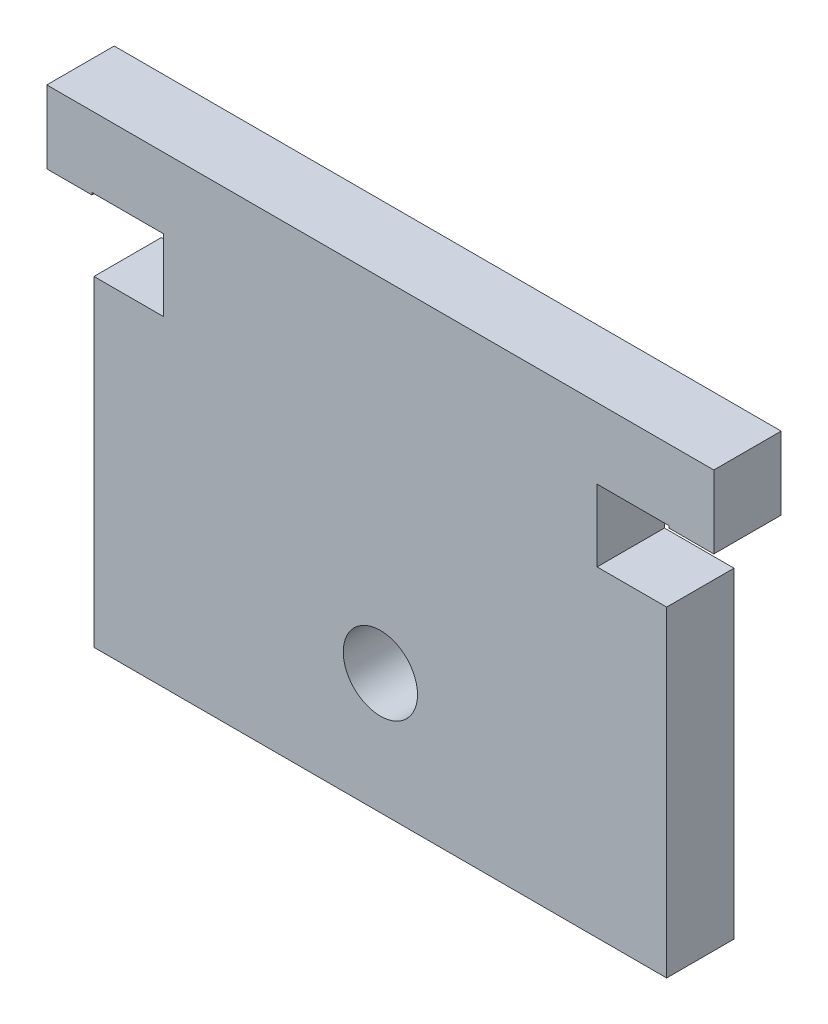
ISO-10303-21;
HEADER;
FILE_DESCRIPTION(('STEP AP214'),'2;1');
FILE_NAME('part.step','',(''),(''),'','','');
FILE_SCHEMA(('AUTOMOTIVE_DESIGN { 1 0 10303 214 1 1 1 1 }'));
ENDSEC;
DATA;
#1=APPLICATION_CONTEXT('core data for automotive mechanical design processes');
#2=APPLICATION_PROTOCOL_DEFINITION('international standard','automotive_design',2000,#1);
#3=PRODUCT_CONTEXT('',#1,'mechanical');
#4=PRODUCT('Part','Part','',(#3));
#5=PRODUCT_RELATED_PRODUCT_CATEGORY('part','',(#4));
#6=PRODUCT_DEFINITION_FORMATION('','',#4);
#7=PRODUCT_DEFINITION_CONTEXT('part definition',#1,'design');
#8=PRODUCT_DEFINITION('design','',#6,#7);
#9=PRODUCT_DEFINITION_SHAPE('','',#8);
#10=(LENGTH_UNIT() NAMED_UNIT(*) SI_UNIT(.MILLI.,.METRE.));
#11=(NAMED_UNIT(*) PLANE_ANGLE_UNIT() SI_UNIT($,.RADIAN.));
#12=(NAMED_UNIT(*) SI_UNIT($,.STERADIAN.) SOLID_ANGLE_UNIT());
#13=UNCERTAINTY_MEASURE_WITH_UNIT(LENGTH_MEASURE(1.E-05),#10,'distance_accuracy_value','');
#14=(GEOMETRIC_REPRESENTATION_CONTEXT(3) GLOBAL_UNCERTAINTY_ASSIGNED_CONTEXT((#13)) GLOBAL_UNIT_ASSIGNED_CONTEXT((#10,
#11,#12)) REPRESENTATION_CONTEXT('',''));
#15=CARTESIAN_POINT('',(0.,0.,0.));
#16=DIRECTION('',(0.,0.,1.));
#17=DIRECTION('',(1.,0.,0.));
#18=AXIS2_PLACEMENT_3D('',#15,#16,#17);
#19=CARTESIAN_POINT('',(0.,0.,6.35));
#20=DIRECTION('',(0.,0.,-1.));
#21=DIRECTION('',(-1.,0.,0.));
#22=AXIS2_PLACEMENT_3D('',#19,#20,#21);
#23=PLANE('',#22);
#24=CARTESIAN_POINT('',(0.00591999999668975,-7.666260004,6.35));
#25=DIRECTION('',(0.,0.,1.));
#26=DIRECTION('',(1.,0.,0.));
#27=AXIS2_PLACEMENT_3D('',#24,#25,#26);
#28=CIRCLE('',#27,3.49999999999999);
#29=CARTESIAN_POINT('',(3.50591999999668,-7.666260004,6.35));
#30=VERTEX_POINT('',#29);
#31=EDGE_CURVE('E207',#30,#30,#28,.T.);
#32=ORIENTED_EDGE('',*,*,#31,.F.);
#33=EDGE_LOOP('',(#32));
#34=FACE_BOUND('',#33,.T.);
#35=DIRECTION('',(0.,1.,0.));
#36=VECTOR('',#35,1.);
#37=CARTESIAN_POINT('',(-20.4343,17.9832,6.35));
#38=LINE('',#37,#36);
#39=CARTESIAN_POINT('',(-20.4343,11.2268,6.35));
#40=VERTEX_POINT('',#39);
#41=CARTESIAN_POINT('',(-20.4343,17.9832,6.35));
#42=VERTEX_POINT('',#41);
#43=EDGE_CURVE('E167',#40,#42,#38,.T.);
#44=ORIENTED_EDGE('',*,*,#43,.F.);
#45=DIRECTION('',(1.,0.,0.));
#46=VECTOR('',#45,1.);
#47=CARTESIAN_POINT('',(-20.4343,11.2268,6.35));
#48=LINE('',#47,#46);
#49=CARTESIAN_POINT('',(-26.9875,11.2268,6.35));
#50=VERTEX_POINT('',#49);
#51=EDGE_CURVE('E187',#50,#40,#48,.T.);
#52=ORIENTED_EDGE('',*,*,#51,.F.);
#53=DIRECTION('',(0.,1.,0.));
#54=VECTOR('',#53,1.);
#55=CARTESIAN_POINT('',(-26.9875,-25.4,6.35));
#56=LINE('',#55,#54);
#57=CARTESIAN_POINT('',(-26.9875,-19.05,6.35));
#58=VERTEX_POINT('',#57);
#59=EDGE_CURVE('E315',#58,#50,#56,.T.);
#60=ORIENTED_EDGE('',*,*,#59,.F.);
#61=DIRECTION('',(-1.,0.,0.));
#62=VECTOR('',#61,1.);
#63=CARTESIAN_POINT('',(-26.9875,-19.05,6.35));
#64=LINE('',#63,#62);
#65=CARTESIAN_POINT('',(26.9875,-19.05,6.35));
#66=VERTEX_POINT('',#65);
#67=EDGE_CURVE('E265',#66,#58,#64,.T.);
#68=ORIENTED_EDGE('',*,*,#67,.F.);
#69=DIRECTION('',(0.,-1.,0.));
#70=VECTOR('',#69,1.);
#71=CARTESIAN_POINT('',(26.9875,-25.4,6.35));
#72=LINE('',#71,#70);
#73=CARTESIAN_POINT('',(26.9875,11.2268,6.35));
#74=VERTEX_POINT('',#73);
#75=EDGE_CURVE('E322',#74,#66,#72,.T.);
#76=ORIENTED_EDGE('',*,*,#75,.F.);
#77=DIRECTION('',(1.,0.,0.));
#78=VECTOR('',#77,1.);
#79=CARTESIAN_POINT('',(20.4343,11.2268,6.35));
#80=LINE('',#79,#78);
#81=CARTESIAN_POINT('',(20.4343,11.2268,6.35));
#82=VERTEX_POINT('',#81);
#83=EDGE_CURVE('E223',#82,#74,#80,.T.);
#84=ORIENTED_EDGE('',*,*,#83,.F.);
#85=DIRECTION('',(0.,-1.,0.));
#86=VECTOR('',#85,1.);
#87=CARTESIAN_POINT('',(20.4343,17.9832,6.35));
#88=LINE('',#87,#86);
#89=CARTESIAN_POINT('',(20.4343,17.9832,6.35));
#90=VERTEX_POINT('',#89);
#91=EDGE_CURVE('E227',#90,#82,#88,.T.);
#92=ORIENTED_EDGE('',*,*,#91,.F.);
#93=DIRECTION('',(-1.,0.,0.));
#94=VECTOR('',#93,1.);
#95=CARTESIAN_POINT('',(20.4343,17.9832,6.35));
#96=LINE('',#95,#94);
#97=CARTESIAN_POINT('',(27.1907,17.9832,6.35));
#98=VERTEX_POINT('',#97);
#99=EDGE_CURVE('E199',#98,#90,#96,.T.);
#100=ORIENTED_EDGE('',*,*,#99,.F.);
#101=DIRECTION('',(0.,1.,0.));
#102=VECTOR('',#101,1.);
#103=CARTESIAN_POINT('',(27.1907,17.9832,6.35));
#104=LINE('',#103,#102);
#105=CARTESIAN_POINT('',(27.1907,17.78,6.35));
#106=VERTEX_POINT('',#105);
#107=EDGE_CURVE('E220',#106,#98,#104,.T.);
#108=ORIENTED_EDGE('',*,*,#107,.F.);
#109=DIRECTION('',(-1.,0.,0.));
#110=VECTOR('',#109,1.);
#111=CARTESIAN_POINT('',(42.8625,17.78,6.35));
#112=LINE('',#111,#110);
#113=CARTESIAN_POINT('',(31.4325,17.78,6.35));
#114=VERTEX_POINT('',#113);
#115=EDGE_CURVE('E319',#114,#106,#112,.T.);
#116=ORIENTED_EDGE('',*,*,#115,.F.);
#117=DIRECTION('',(0.,1.,0.));
#118=VECTOR('',#117,1.);
#119=CARTESIAN_POINT('',(31.4325,24.638,6.35));
#120=LINE('',#119,#118);
#121=CARTESIAN_POINT('',(31.4325,24.638,6.35));
#122=VERTEX_POINT('',#121);
#123=EDGE_CURVE('E276',#114,#122,#120,.T.);
#124=ORIENTED_EDGE('',*,*,#123,.T.);
#125=DIRECTION('',(1.,0.,0.));
#126=VECTOR('',#125,1.);
#127=CARTESIAN_POINT('',(-42.8625,24.638,6.35));
#128=LINE('',#127,#126);
#129=CARTESIAN_POINT('',(-31.4325,24.638,6.35));
#130=VERTEX_POINT('',#129);
#131=EDGE_CURVE('E299',#130,#122,#128,.T.);
#132=ORIENTED_EDGE('',*,*,#131,.F.);
#133=DIRECTION('',(0.,1.,0.));
#134=VECTOR('',#133,1.);
#135=CARTESIAN_POINT('',(-31.4325,24.638,6.35));
#136=LINE('',#135,#134);
#137=CARTESIAN_POINT('',(-31.4325,17.78,6.35));
#138=VERTEX_POINT('',#137);
#139=EDGE_CURVE('E292',#138,#130,#136,.T.);
#140=ORIENTED_EDGE('',*,*,#139,.F.);
#141=DIRECTION('',(-1.,0.,0.));
#142=VECTOR('',#141,1.);
#143=CARTESIAN_POINT('',(-42.8625,17.78,6.35));
#144=LINE('',#143,#142);
#145=CARTESIAN_POINT('',(-27.1907,17.78,6.35));
#146=VERTEX_POINT('',#145);
#147=EDGE_CURVE('E311',#146,#138,#144,.T.);
#148=ORIENTED_EDGE('',*,*,#147,.F.);
#149=DIRECTION('',(0.,-1.,0.));
#150=VECTOR('',#149,1.);
#151=CARTESIAN_POINT('',(-27.1907,17.9832,6.35));
#152=LINE('',#151,#150);
#153=CARTESIAN_POINT('',(-27.1907,17.9832,6.35));
#154=VERTEX_POINT('',#153);
#155=EDGE_CURVE('E69',#154,#146,#152,.T.);
#156=ORIENTED_EDGE('',*,*,#155,.F.);
#157=DIRECTION('',(-1.,0.,0.));
#158=VECTOR('',#157,1.);
#159=CARTESIAN_POINT('',(-20.4343,17.9832,6.35));
#160=LINE('',#159,#158);
#161=EDGE_CURVE('E198',#42,#154,#160,.T.);
#162=ORIENTED_EDGE('',*,*,#161,.F.);
#163=EDGE_LOOP('',(#44,#52,#60,#68,#76,#84,#92,#100,#108,#116,#124,#132,#140,#148,#156,#162));
#164=FACE_BOUND('',#163,.T.);
#165=ADVANCED_FACE('F45',(#34,#164),#23,.F.);
#166=CARTESIAN_POINT('',(0.,0.,0.));
#167=DIRECTION('',(0.,0.,-1.));
#168=DIRECTION('',(-1.,0.,0.));
#169=AXIS2_PLACEMENT_3D('',#166,#167,#168);
#170=PLANE('',#169);
#171=DIRECTION('',(1.,0.,0.));
#172=VECTOR('',#171,1.);
#173=CARTESIAN_POINT('',(-20.4343,11.2268,0.));
#174=LINE('',#173,#172);
#175=CARTESIAN_POINT('',(-26.9875,11.2268,0.));
#176=VERTEX_POINT('',#175);
#177=CARTESIAN_POINT('',(-20.4343,11.2268,0.));
#178=VERTEX_POINT('',#177);
#179=EDGE_CURVE('E173',#176,#178,#174,.T.);
#180=ORIENTED_EDGE('',*,*,#179,.T.);
#181=DIRECTION('',(0.,1.,0.));
#182=VECTOR('',#181,1.);
#183=CARTESIAN_POINT('',(-20.4343,17.9832,0.));
#184=LINE('',#183,#182);
#185=CARTESIAN_POINT('',(-20.4343,17.9832,0.));
#186=VERTEX_POINT('',#185);
#187=EDGE_CURVE('E164',#178,#186,#184,.T.);
#188=ORIENTED_EDGE('',*,*,#187,.T.);
#189=DIRECTION('',(-1.,0.,0.));
#190=VECTOR('',#189,1.);
#191=CARTESIAN_POINT('',(-20.4343,17.9832,0.));
#192=LINE('',#191,#190);
#193=CARTESIAN_POINT('',(-27.1907,17.9832,0.));
#194=VERTEX_POINT('',#193);
#195=EDGE_CURVE('E176',#186,#194,#192,.T.);
#196=ORIENTED_EDGE('',*,*,#195,.T.);
#197=DIRECTION('',(0.,-1.,0.));
#198=VECTOR('',#197,1.);
#199=CARTESIAN_POINT('',(-27.1907,17.9832,0.));
#200=LINE('',#199,#198);
#201=CARTESIAN_POINT('',(-27.1907,17.78,0.));
#202=VERTEX_POINT('',#201);
#203=EDGE_CURVE('E182',#194,#202,#200,.T.);
#204=ORIENTED_EDGE('',*,*,#203,.T.);
#205=DIRECTION('',(-1.,0.,0.));
#206=VECTOR('',#205,1.);
#207=CARTESIAN_POINT('',(-42.8625,17.78,0.));
#208=LINE('',#207,#206);
#209=CARTESIAN_POINT('',(-31.4325,17.78,0.));
#210=VERTEX_POINT('',#209);
#211=EDGE_CURVE('E310',#202,#210,#208,.T.);
#212=ORIENTED_EDGE('',*,*,#211,.T.);
#213=DIRECTION('',(0.,-1.,0.));
#214=VECTOR('',#213,1.);
#215=CARTESIAN_POINT('',(-31.4325,24.638,0.));
#216=LINE('',#215,#214);
#217=CARTESIAN_POINT('',(-31.4325,24.638,0.));
#218=VERTEX_POINT('',#217);
#219=EDGE_CURVE('E284',#218,#210,#216,.T.);
#220=ORIENTED_EDGE('',*,*,#219,.F.);
#221=DIRECTION('',(-1.,0.,0.));
#222=VECTOR('',#221,1.);
#223=CARTESIAN_POINT('',(-42.8625,24.638,0.));
#224=LINE('',#223,#222);
#225=CARTESIAN_POINT('',(31.4325,24.638,0.));
#226=VERTEX_POINT('',#225);
#227=EDGE_CURVE('E303',#226,#218,#224,.T.);
#228=ORIENTED_EDGE('',*,*,#227,.F.);
#229=DIRECTION('',(0.,-1.,0.));
#230=VECTOR('',#229,1.);
#231=CARTESIAN_POINT('',(31.4325,24.638,0.));
#232=LINE('',#231,#230);
#233=CARTESIAN_POINT('',(31.4325,17.78,0.));
#234=VERTEX_POINT('',#233);
#235=EDGE_CURVE('E268',#226,#234,#232,.T.);
#236=ORIENTED_EDGE('',*,*,#235,.T.);
#237=DIRECTION('',(-1.,0.,0.));
#238=VECTOR('',#237,1.);
#239=CARTESIAN_POINT('',(42.8625,17.78,0.));
#240=LINE('',#239,#238);
#241=CARTESIAN_POINT('',(27.1907,17.78,0.));
#242=VERTEX_POINT('',#241);
#243=EDGE_CURVE('E325',#234,#242,#240,.T.);
#244=ORIENTED_EDGE('',*,*,#243,.T.);
#245=DIRECTION('',(0.,1.,0.));
#246=VECTOR('',#245,1.);
#247=CARTESIAN_POINT('',(27.1907,17.9832,0.));
#248=LINE('',#247,#246);
#249=CARTESIAN_POINT('',(27.1907,17.9832,0.));
#250=VERTEX_POINT('',#249);
#251=EDGE_CURVE('E61',#242,#250,#248,.T.);
#252=ORIENTED_EDGE('',*,*,#251,.T.);
#253=DIRECTION('',(-1.,0.,0.));
#254=VECTOR('',#253,1.);
#255=CARTESIAN_POINT('',(20.4343,17.9832,0.));
#256=LINE('',#255,#254);
#257=CARTESIAN_POINT('',(20.4343,17.9832,0.));
#258=VERTEX_POINT('',#257);
#259=EDGE_CURVE('E224',#250,#258,#256,.T.);
#260=ORIENTED_EDGE('',*,*,#259,.T.);
#261=DIRECTION('',(0.,-1.,0.));
#262=VECTOR('',#261,1.);
#263=CARTESIAN_POINT('',(20.4343,17.9832,0.));
#264=LINE('',#263,#262);
#265=CARTESIAN_POINT('',(20.4343,11.2268,0.));
#266=VERTEX_POINT('',#265);
#267=EDGE_CURVE('E240',#258,#266,#264,.T.);
#268=ORIENTED_EDGE('',*,*,#267,.T.);
#269=DIRECTION('',(1.,0.,0.));
#270=VECTOR('',#269,1.);
#271=CARTESIAN_POINT('',(20.4343,11.2268,0.));
#272=LINE('',#271,#270);
#273=CARTESIAN_POINT('',(26.9875,11.2268,0.));
#274=VERTEX_POINT('',#273);
#275=EDGE_CURVE('E236',#266,#274,#272,.T.);
#276=ORIENTED_EDGE('',*,*,#275,.T.);
#277=DIRECTION('',(0.,-1.,0.));
#278=VECTOR('',#277,1.);
#279=CARTESIAN_POINT('',(26.9875,-25.4,0.));
#280=LINE('',#279,#278);
#281=CARTESIAN_POINT('',(26.9875,-19.05,0.));
#282=VERTEX_POINT('',#281);
#283=EDGE_CURVE('E306',#274,#282,#280,.T.);
#284=ORIENTED_EDGE('',*,*,#283,.T.);
#285=DIRECTION('',(1.,0.,0.));
#286=VECTOR('',#285,1.);
#287=CARTESIAN_POINT('',(-26.9875,-19.05,0.));
#288=LINE('',#287,#286);
#289=CARTESIAN_POINT('',(-26.9875,-19.05,0.));
#290=VERTEX_POINT('',#289);
#291=EDGE_CURVE('E257',#290,#282,#288,.T.);
#292=ORIENTED_EDGE('',*,*,#291,.F.);
#293=DIRECTION('',(0.,1.,0.));
#294=VECTOR('',#293,1.);
#295=CARTESIAN_POINT('',(-26.9875,-25.4,0.));
#296=LINE('',#295,#294);
#297=EDGE_CURVE('E307',#290,#176,#296,.T.);
#298=ORIENTED_EDGE('',*,*,#297,.T.);
#299=EDGE_LOOP('',(#180,#188,#196,#204,#212,#220,#228,#236,#244,#252,#260,#268,#276,#284,#292,#298));
#300=FACE_BOUND('',#299,.T.);
#301=CARTESIAN_POINT('',(0.00591999999668975,-7.666260004,0.));
#302=DIRECTION('',(0.,0.,1.));
#303=DIRECTION('',(1.,0.,0.));
#304=AXIS2_PLACEMENT_3D('',#301,#302,#303);
#305=CIRCLE('',#304,3.5);
#306=CARTESIAN_POINT('',(3.50591999999669,-7.666260004,0.));
#307=VERTEX_POINT('',#306);
#308=EDGE_CURVE('E250',#307,#307,#305,.T.);
#309=ORIENTED_EDGE('',*,*,#308,.T.);
#310=EDGE_LOOP('',(#309));
#311=FACE_BOUND('',#310,.T.);
#312=ADVANCED_FACE('F47',(#300,#311),#170,.T.);
#313=CARTESIAN_POINT('',(26.9875,-25.4,0.));
#314=DIRECTION('',(-1.,0.,0.));
#315=DIRECTION('',(0.,0.,1.));
#316=AXIS2_PLACEMENT_3D('',#313,#314,#315);
#317=PLANE('',#316);
#318=ORIENTED_EDGE('',*,*,#283,.F.);
#319=DIRECTION('',(0.,0.,1.));
#320=VECTOR('',#319,1.);
#321=CARTESIAN_POINT('',(26.9875,11.2268,0.));
#322=LINE('',#321,#320);
#323=EDGE_CURVE('E11',#274,#74,#322,.T.);
#324=ORIENTED_EDGE('',*,*,#323,.T.);
#325=ORIENTED_EDGE('',*,*,#75,.T.);
#326=DIRECTION('',(0.,0.,1.));
#327=VECTOR('',#326,1.);
#328=CARTESIAN_POINT('',(26.9875,-19.05,6.35));
#329=LINE('',#328,#327);
#330=EDGE_CURVE('E261',#282,#66,#329,.T.);
#331=ORIENTED_EDGE('',*,*,#330,.F.);
#332=EDGE_LOOP('',(#318,#324,#325,#331));
#333=FACE_BOUND('',#332,.T.);
#334=ADVANCED_FACE('F354',(#333),#317,.F.);
#335=CARTESIAN_POINT('',(-26.9875,-25.4,0.));
#336=DIRECTION('',(1.,0.,0.));
#337=DIRECTION('',(0.,0.,-1.));
#338=AXIS2_PLACEMENT_3D('',#335,#336,#337);
#339=PLANE('',#338);
#340=ORIENTED_EDGE('',*,*,#59,.T.);
#341=DIRECTION('',(0.,0.,-1.));
#342=VECTOR('',#341,1.);
#343=CARTESIAN_POINT('',(-26.9875,11.2268,0.));
#344=LINE('',#343,#342);
#345=EDGE_CURVE('E54',#50,#176,#344,.T.);
#346=ORIENTED_EDGE('',*,*,#345,.T.);
#347=ORIENTED_EDGE('',*,*,#297,.F.);
#348=DIRECTION('',(0.,0.,-1.));
#349=VECTOR('',#348,1.);
#350=CARTESIAN_POINT('',(-26.9875,-19.05,6.35));
#351=LINE('',#350,#349);
#352=EDGE_CURVE('E254',#58,#290,#351,.T.);
#353=ORIENTED_EDGE('',*,*,#352,.F.);
#354=EDGE_LOOP('',(#340,#346,#347,#353));
#355=FACE_BOUND('',#354,.T.);
#356=ADVANCED_FACE('F342',(#355),#339,.F.);
#357=CARTESIAN_POINT('',(0.,24.638,0.));
#358=DIRECTION('',(0.,1.,0.));
#359=DIRECTION('',(0.,0.,1.));
#360=AXIS2_PLACEMENT_3D('',#357,#358,#359);
#361=PLANE('',#360);
#362=ORIENTED_EDGE('',*,*,#131,.T.);
#363=DIRECTION('',(0.,0.,-1.));
#364=VECTOR('',#363,1.);
#365=CARTESIAN_POINT('',(31.4325,24.638,0.));
#366=LINE('',#365,#364);
#367=EDGE_CURVE('E272',#122,#226,#366,.T.);
#368=ORIENTED_EDGE('',*,*,#367,.T.);
#369=ORIENTED_EDGE('',*,*,#227,.T.);
#370=DIRECTION('',(0.,0.,-1.));
#371=VECTOR('',#370,1.);
#372=CARTESIAN_POINT('',(-31.4325,24.638,0.));
#373=LINE('',#372,#371);
#374=EDGE_CURVE('E295',#130,#218,#373,.T.);
#375=ORIENTED_EDGE('',*,*,#374,.F.);
#376=EDGE_LOOP('',(#362,#368,#369,#375));
#377=FACE_BOUND('',#376,.T.);
#378=ADVANCED_FACE('F385',(#377),#361,.T.);
#379=CARTESIAN_POINT('',(42.8625,17.78,0.));
#380=DIRECTION('',(0.,1.,0.));
#381=DIRECTION('',(-1.,0.,0.));
#382=AXIS2_PLACEMENT_3D('',#379,#380,#381);
#383=PLANE('',#382);
#384=ORIENTED_EDGE('',*,*,#115,.T.);
#385=DIRECTION('',(0.,0.,-1.));
#386=VECTOR('',#385,1.);
#387=CARTESIAN_POINT('',(27.1907,17.78,0.));
#388=LINE('',#387,#386);
#389=EDGE_CURVE('E336',#106,#242,#388,.T.);
#390=ORIENTED_EDGE('',*,*,#389,.T.);
#391=ORIENTED_EDGE('',*,*,#243,.F.);
#392=DIRECTION('',(0.,0.,1.));
#393=VECTOR('',#392,1.);
#394=CARTESIAN_POINT('',(31.4325,17.78,0.));
#395=LINE('',#394,#393);
#396=EDGE_CURVE('E280',#234,#114,#395,.T.);
#397=ORIENTED_EDGE('',*,*,#396,.T.);
#398=EDGE_LOOP('',(#384,#390,#391,#397));
#399=FACE_BOUND('',#398,.T.);
#400=ADVANCED_FACE('F381',(#399),#383,.F.);
#401=CARTESIAN_POINT('',(-42.8625,17.78,0.));
#402=DIRECTION('',(0.,1.,0.));
#403=DIRECTION('',(0.,0.,1.));
#404=AXIS2_PLACEMENT_3D('',#401,#402,#403);
#405=PLANE('',#404);
#406=ORIENTED_EDGE('',*,*,#211,.F.);
#407=DIRECTION('',(0.,0.,1.));
#408=VECTOR('',#407,1.);
#409=CARTESIAN_POINT('',(-27.1907,17.78,0.));
#410=LINE('',#409,#408);
#411=EDGE_CURVE('E314',#202,#146,#410,.T.);
#412=ORIENTED_EDGE('',*,*,#411,.T.);
#413=ORIENTED_EDGE('',*,*,#147,.T.);
#414=DIRECTION('',(0.,0.,1.));
#415=VECTOR('',#414,1.);
#416=CARTESIAN_POINT('',(-31.4325,17.78,0.));
#417=LINE('',#416,#415);
#418=EDGE_CURVE('E288',#210,#138,#417,.T.);
#419=ORIENTED_EDGE('',*,*,#418,.F.);
#420=EDGE_LOOP('',(#406,#412,#413,#419));
#421=FACE_BOUND('',#420,.T.);
#422=ADVANCED_FACE('F384',(#421),#405,.F.);
#423=CARTESIAN_POINT('',(-31.4325,0.,0.));
#424=DIRECTION('',(-1.,0.,0.));
#425=DIRECTION('',(0.,0.,1.));
#426=AXIS2_PLACEMENT_3D('',#423,#424,#425);
#427=PLANE('',#426);
#428=ORIENTED_EDGE('',*,*,#219,.T.);
#429=ORIENTED_EDGE('',*,*,#418,.T.);
#430=ORIENTED_EDGE('',*,*,#139,.T.);
#431=ORIENTED_EDGE('',*,*,#374,.T.);
#432=EDGE_LOOP('',(#428,#429,#430,#431));
#433=FACE_BOUND('',#432,.T.);
#434=ADVANCED_FACE('F390',(#433),#427,.T.);
#435=CARTESIAN_POINT('',(31.4325,0.,0.));
#436=DIRECTION('',(1.,0.,0.));
#437=DIRECTION('',(0.,0.,1.));
#438=AXIS2_PLACEMENT_3D('',#435,#436,#437);
#439=PLANE('',#438);
#440=ORIENTED_EDGE('',*,*,#235,.F.);
#441=ORIENTED_EDGE('',*,*,#367,.F.);
#442=ORIENTED_EDGE('',*,*,#123,.F.);
#443=ORIENTED_EDGE('',*,*,#396,.F.);
#444=EDGE_LOOP('',(#440,#441,#442,#443));
#445=FACE_BOUND('',#444,.T.);
#446=ADVANCED_FACE('F397',(#445),#439,.T.);
#447=CARTESIAN_POINT('',(0.,-19.05,0.));
#448=DIRECTION('',(0.,-1.,0.));
#449=DIRECTION('',(0.,0.,-1.));
#450=AXIS2_PLACEMENT_3D('',#447,#448,#449);
#451=PLANE('',#450);
#452=ORIENTED_EDGE('',*,*,#352,.T.);
#453=ORIENTED_EDGE('',*,*,#291,.T.);
#454=ORIENTED_EDGE('',*,*,#330,.T.);
#455=ORIENTED_EDGE('',*,*,#67,.T.);
#456=EDGE_LOOP('',(#452,#453,#454,#455));
#457=FACE_BOUND('',#456,.T.);
#458=ADVANCED_FACE('F351',(#457),#451,.T.);
#459=CARTESIAN_POINT('',(0.00591999999668975,-7.666260004,6.35));
#460=DIRECTION('',(0.,0.,1.));
#461=DIRECTION('',(1.,0.,0.));
#462=AXIS2_PLACEMENT_3D('',#459,#460,#461);
#463=CYLINDRICAL_SURFACE('',#462,3.49999999999999);
#464=ORIENTED_EDGE('',*,*,#308,.F.);
#465=EDGE_LOOP('',(#464));
#466=FACE_BOUND('',#465,.T.);
#467=ORIENTED_EDGE('',*,*,#31,.T.);
#468=EDGE_LOOP('',(#467));
#469=FACE_BOUND('',#468,.T.);
#470=ADVANCED_FACE('F362',(#466,#469),#463,.F.);
#471=CARTESIAN_POINT('',(-20.4343,11.2268,0.));
#472=DIRECTION('',(0.,-1.,0.));
#473=DIRECTION('',(0.,0.,-1.));
#474=AXIS2_PLACEMENT_3D('',#471,#472,#473);
#475=PLANE('',#474);
#476=ORIENTED_EDGE('',*,*,#51,.T.);
#477=DIRECTION('',(0.,0.,1.));
#478=VECTOR('',#477,1.);
#479=CARTESIAN_POINT('',(-20.4343,11.2268,0.));
#480=LINE('',#479,#478);
#481=EDGE_CURVE('E204',#178,#40,#480,.T.);
#482=ORIENTED_EDGE('',*,*,#481,.F.);
#483=ORIENTED_EDGE('',*,*,#179,.F.);
#484=ORIENTED_EDGE('',*,*,#345,.F.);
#485=EDGE_LOOP('',(#476,#482,#483,#484));
#486=FACE_BOUND('',#485,.T.);
#487=ADVANCED_FACE('F359',(#486),#475,.F.);
#488=CARTESIAN_POINT('',(-27.1907,17.9832,0.));
#489=DIRECTION('',(-1.,0.,0.));
#490=DIRECTION('',(0.,0.,1.));
#491=AXIS2_PLACEMENT_3D('',#488,#489,#490);
#492=PLANE('',#491);
#493=ORIENTED_EDGE('',*,*,#203,.F.);
#494=DIRECTION('',(0.,0.,1.));
#495=VECTOR('',#494,1.);
#496=CARTESIAN_POINT('',(-27.1907,17.9832,0.));
#497=LINE('',#496,#495);
#498=EDGE_CURVE('E172',#194,#154,#497,.T.);
#499=ORIENTED_EDGE('',*,*,#498,.T.);
#500=ORIENTED_EDGE('',*,*,#155,.T.);
#501=ORIENTED_EDGE('',*,*,#411,.F.);
#502=EDGE_LOOP('',(#493,#499,#500,#501));
#503=FACE_BOUND('',#502,.T.);
#504=ADVANCED_FACE('F361',(#503),#492,.F.);
#505=CARTESIAN_POINT('',(-20.4343,17.9832,0.));
#506=DIRECTION('',(1.,0.,0.));
#507=DIRECTION('',(0.,0.,-1.));
#508=AXIS2_PLACEMENT_3D('',#505,#506,#507);
#509=PLANE('',#508);
#510=ORIENTED_EDGE('',*,*,#43,.T.);
#511=DIRECTION('',(0.,0.,1.));
#512=VECTOR('',#511,1.);
#513=CARTESIAN_POINT('',(-20.4343,17.9832,0.));
#514=LINE('',#513,#512);
#515=EDGE_CURVE('E159',#186,#42,#514,.T.);
#516=ORIENTED_EDGE('',*,*,#515,.F.);
#517=ORIENTED_EDGE('',*,*,#187,.F.);
#518=ORIENTED_EDGE('',*,*,#481,.T.);
#519=EDGE_LOOP('',(#510,#516,#517,#518));
#520=FACE_BOUND('',#519,.T.);
#521=ADVANCED_FACE('F161',(#520),#509,.F.);
#522=CARTESIAN_POINT('',(-20.4343,17.9832,0.));
#523=DIRECTION('',(0.,1.,0.));
#524=DIRECTION('',(0.,0.,1.));
#525=AXIS2_PLACEMENT_3D('',#522,#523,#524);
#526=PLANE('',#525);
#527=ORIENTED_EDGE('',*,*,#161,.T.);
#528=ORIENTED_EDGE('',*,*,#498,.F.);
#529=ORIENTED_EDGE('',*,*,#195,.F.);
#530=ORIENTED_EDGE('',*,*,#515,.T.);
#531=EDGE_LOOP('',(#527,#528,#529,#530));
#532=FACE_BOUND('',#531,.T.);
#533=ADVANCED_FACE('F177',(#532),#526,.F.);
#534=CARTESIAN_POINT('',(20.4343,11.2268,0.));
#535=DIRECTION('',(0.,-1.,0.));
#536=DIRECTION('',(0.,0.,-1.));
#537=AXIS2_PLACEMENT_3D('',#534,#535,#536);
#538=PLANE('',#537);
#539=ORIENTED_EDGE('',*,*,#275,.F.);
#540=DIRECTION('',(0.,0.,1.));
#541=VECTOR('',#540,1.);
#542=CARTESIAN_POINT('',(20.4343,11.2268,0.));
#543=LINE('',#542,#541);
#544=EDGE_CURVE('E213',#266,#82,#543,.T.);
#545=ORIENTED_EDGE('',*,*,#544,.T.);
#546=ORIENTED_EDGE('',*,*,#83,.T.);
#547=ORIENTED_EDGE('',*,*,#323,.F.);
#548=EDGE_LOOP('',(#539,#545,#546,#547));
#549=FACE_BOUND('',#548,.T.);
#550=ADVANCED_FACE('F408',(#549),#538,.F.);
#551=CARTESIAN_POINT('',(27.1907,17.9832,0.));
#552=DIRECTION('',(1.,0.,0.));
#553=DIRECTION('',(0.,0.,-1.));
#554=AXIS2_PLACEMENT_3D('',#551,#552,#553);
#555=PLANE('',#554);
#556=ORIENTED_EDGE('',*,*,#107,.T.);
#557=DIRECTION('',(0.,0.,1.));
#558=VECTOR('',#557,1.);
#559=CARTESIAN_POINT('',(27.1907,17.9832,0.));
#560=LINE('',#559,#558);
#561=EDGE_CURVE('E216',#250,#98,#560,.T.);
#562=ORIENTED_EDGE('',*,*,#561,.F.);
#563=ORIENTED_EDGE('',*,*,#251,.F.);
#564=ORIENTED_EDGE('',*,*,#389,.F.);
#565=EDGE_LOOP('',(#556,#562,#563,#564));
#566=FACE_BOUND('',#565,.T.);
#567=ADVANCED_FACE('F404',(#566),#555,.F.);
#568=CARTESIAN_POINT('',(20.4343,17.9832,0.));
#569=DIRECTION('',(0.,1.,0.));
#570=DIRECTION('',(0.,0.,1.));
#571=AXIS2_PLACEMENT_3D('',#568,#569,#570);
#572=PLANE('',#571);
#573=ORIENTED_EDGE('',*,*,#99,.T.);
#574=DIRECTION('',(0.,0.,1.));
#575=VECTOR('',#574,1.);
#576=CARTESIAN_POINT('',(20.4343,17.9832,0.));
#577=LINE('',#576,#575);
#578=EDGE_CURVE('E210',#258,#90,#577,.T.);
#579=ORIENTED_EDGE('',*,*,#578,.F.);
#580=ORIENTED_EDGE('',*,*,#259,.F.);
#581=ORIENTED_EDGE('',*,*,#561,.T.);
#582=EDGE_LOOP('',(#573,#579,#580,#581));
#583=FACE_BOUND('',#582,.T.);
#584=ADVANCED_FACE('F407',(#583),#572,.F.);
#585=CARTESIAN_POINT('',(20.4343,17.9832,0.));
#586=DIRECTION('',(-1.,0.,0.));
#587=DIRECTION('',(0.,0.,1.));
#588=AXIS2_PLACEMENT_3D('',#585,#586,#587);
#589=PLANE('',#588);
#590=ORIENTED_EDGE('',*,*,#91,.T.);
#591=ORIENTED_EDGE('',*,*,#544,.F.);
#592=ORIENTED_EDGE('',*,*,#267,.F.);
#593=ORIENTED_EDGE('',*,*,#578,.T.);
#594=EDGE_LOOP('',(#590,#591,#592,#593));
#595=FACE_BOUND('',#594,.T.);
#596=ADVANCED_FACE('F412',(#595),#589,.F.);
#597=CLOSED_SHELL('',(#165,#312,#334,#356,#378,#400,#422,#434,#446,#458,#470,#487,#504,#521,
#533,#550,#567,#584,#596));
#598=MANIFOLD_SOLID_BREP('B2',#597);
#599=ADVANCED_BREP_SHAPE_REPRESENTATION('',(#18,#598),#14);
#600=SHAPE_DEFINITION_REPRESENTATION(#9,#599);
ENDSEC;
END-ISO-10303-21;
